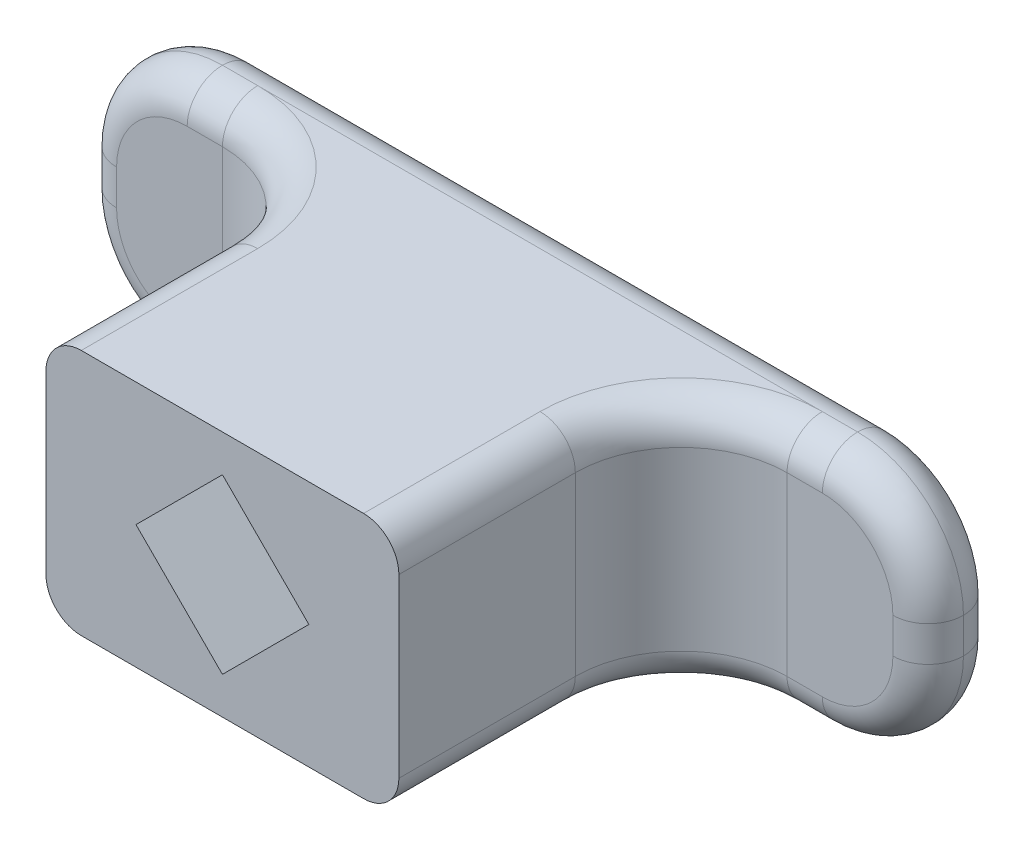
ISO-10303-21;
HEADER;
FILE_DESCRIPTION(('STEP AP214'),'2;1');
FILE_NAME('part.step','',(''),(''),'','','');
FILE_SCHEMA(('AUTOMOTIVE_DESIGN { 1 0 10303 214 1 1 1 1 }'));
ENDSEC;
DATA;
#1=APPLICATION_CONTEXT('core data for automotive mechanical design processes');
#2=APPLICATION_PROTOCOL_DEFINITION('international standard','automotive_design',2000,#1);
#3=PRODUCT_CONTEXT('',#1,'mechanical');
#4=PRODUCT('Part','Part','',(#3));
#5=PRODUCT_RELATED_PRODUCT_CATEGORY('part','',(#4));
#6=PRODUCT_DEFINITION_FORMATION('','',#4);
#7=PRODUCT_DEFINITION_CONTEXT('part definition',#1,'design');
#8=PRODUCT_DEFINITION('design','',#6,#7);
#9=PRODUCT_DEFINITION_SHAPE('','',#8);
#10=(LENGTH_UNIT() NAMED_UNIT(*) SI_UNIT(.MILLI.,.METRE.));
#11=(NAMED_UNIT(*) PLANE_ANGLE_UNIT() SI_UNIT($,.RADIAN.));
#12=(NAMED_UNIT(*) SI_UNIT($,.STERADIAN.) SOLID_ANGLE_UNIT());
#13=UNCERTAINTY_MEASURE_WITH_UNIT(LENGTH_MEASURE(1.E-05),#10,'distance_accuracy_value','');
#14=(GEOMETRIC_REPRESENTATION_CONTEXT(3) GLOBAL_UNCERTAINTY_ASSIGNED_CONTEXT((#13)) GLOBAL_UNIT_ASSIGNED_CONTEXT((#10,
#11,#12)) REPRESENTATION_CONTEXT('',''));
#15=CARTESIAN_POINT('',(0.,0.,0.));
#16=DIRECTION('',(0.,0.,1.));
#17=DIRECTION('',(1.,0.,0.));
#18=AXIS2_PLACEMENT_3D('',#15,#16,#17);
#19=CARTESIAN_POINT('',(5.,3.5,-8.));
#20=DIRECTION('',(-1.,0.,0.));
#21=DIRECTION('',(0.,0.,1.));
#22=AXIS2_PLACEMENT_3D('',#19,#20,#21);
#23=PLANE('',#22);
#24=DIRECTION('',(0.,-1.,0.));
#25=VECTOR('',#24,1.);
#26=CARTESIAN_POINT('',(5.00000000000002,3.5,-4.99999999999998));
#27=LINE('',#26,#25);
#28=CARTESIAN_POINT('',(5.00000000000002,-2.5,-4.99999999999998));
#29=VERTEX_POINT('',#28);
#30=CARTESIAN_POINT('',(5.00000000000002,2.5,-4.99999999999998));
#31=VERTEX_POINT('',#30);
#32=EDGE_CURVE('E340',#29,#31,#27,.F.);
#33=ORIENTED_EDGE('',*,*,#32,.T.);
#34=DIRECTION('',(0.,0.,-1.));
#35=VECTOR('',#34,1.);
#36=CARTESIAN_POINT('',(5.,2.5,-8.));
#37=LINE('',#36,#35);
#38=CARTESIAN_POINT('',(5.00000000000005,2.5,0.));
#39=VERTEX_POINT('',#38);
#40=EDGE_CURVE('E361',#31,#39,#37,.F.);
#41=ORIENTED_EDGE('',*,*,#40,.T.);
#42=DIRECTION('',(0.,-1.,0.));
#43=VECTOR('',#42,1.);
#44=CARTESIAN_POINT('',(5.00000000000005,3.5,0.));
#45=LINE('',#44,#43);
#46=CARTESIAN_POINT('',(5.00000000000005,-2.5,0.));
#47=VERTEX_POINT('',#46);
#48=EDGE_CURVE('E328',#39,#47,#45,.T.);
#49=ORIENTED_EDGE('',*,*,#48,.T.);
#50=DIRECTION('',(0.,0.,-1.));
#51=VECTOR('',#50,1.);
#52=CARTESIAN_POINT('',(5.00000000000002,-2.5,-4.99999999999998));
#53=LINE('',#52,#51);
#54=EDGE_CURVE('E359',#47,#29,#53,.T.);
#55=ORIENTED_EDGE('',*,*,#54,.T.);
#56=EDGE_LOOP('',(#33,#41,#49,#55));
#57=FACE_BOUND('',#56,.T.);
#58=ADVANCED_FACE('F35',(#57),#23,.F.);
#59=CARTESIAN_POINT('',(5.,3.5,-8.));
#60=DIRECTION('',(0.,0.,-1.));
#61=DIRECTION('',(-1.,0.,0.));
#62=AXIS2_PLACEMENT_3D('',#59,#60,#61);
#63=PLANE('',#62);
#64=DIRECTION('',(0.,-1.,0.));
#65=VECTOR('',#64,1.);
#66=CARTESIAN_POINT('',(8.00000000000002,-3.5,-8.));
#67=LINE('',#66,#65);
#68=CARTESIAN_POINT('',(8.00000000000002,2.5,-8.));
#69=VERTEX_POINT('',#68);
#70=CARTESIAN_POINT('',(8.00000000000002,-2.5,-8.));
#71=VERTEX_POINT('',#70);
#72=EDGE_CURVE('E337',#69,#71,#67,.T.);
#73=ORIENTED_EDGE('',*,*,#72,.T.);
#74=DIRECTION('',(1.,0.,0.));
#75=VECTOR('',#74,1.);
#76=CARTESIAN_POINT('',(9.,-2.5,-8.));
#77=LINE('',#76,#75);
#78=CARTESIAN_POINT('',(9.,-2.5,-8.));
#79=VERTEX_POINT('',#78);
#80=EDGE_CURVE('E393',#71,#79,#77,.T.);
#81=ORIENTED_EDGE('',*,*,#80,.T.);
#82=CARTESIAN_POINT('',(9.,-0.5,-8.));
#83=DIRECTION('',(0.,0.,-1.));
#84=DIRECTION('',(-1.,0.,0.));
#85=AXIS2_PLACEMENT_3D('',#82,#83,#84);
#86=CIRCLE('',#85,2.);
#87=CARTESIAN_POINT('',(11.,-0.5,-8.));
#88=VERTEX_POINT('',#87);
#89=EDGE_CURVE('E391',#79,#88,#86,.F.);
#90=ORIENTED_EDGE('',*,*,#89,.T.);
#91=DIRECTION('',(0.,-1.,0.));
#92=VECTOR('',#91,1.);
#93=CARTESIAN_POINT('',(11.,3.5,-8.));
#94=LINE('',#93,#92);
#95=CARTESIAN_POINT('',(11.,0.5,-8.));
#96=VERTEX_POINT('',#95);
#97=EDGE_CURVE('E389',#88,#96,#94,.F.);
#98=ORIENTED_EDGE('',*,*,#97,.T.);
#99=CARTESIAN_POINT('',(9.,0.5,-8.));
#100=DIRECTION('',(0.,0.,-1.));
#101=DIRECTION('',(-1.,0.,0.));
#102=AXIS2_PLACEMENT_3D('',#99,#100,#101);
#103=CIRCLE('',#102,2.);
#104=CARTESIAN_POINT('',(9.,2.5,-8.));
#105=VERTEX_POINT('',#104);
#106=EDGE_CURVE('E387',#96,#105,#103,.F.);
#107=ORIENTED_EDGE('',*,*,#106,.T.);
#108=DIRECTION('',(1.,0.,0.));
#109=VECTOR('',#108,1.);
#110=CARTESIAN_POINT('',(5.,2.5,-8.));
#111=LINE('',#110,#109);
#112=EDGE_CURVE('E385',#105,#69,#111,.F.);
#113=ORIENTED_EDGE('',*,*,#112,.T.);
#114=EDGE_LOOP('',(#73,#81,#90,#98,#107,#113));
#115=FACE_BOUND('',#114,.T.);
#116=ADVANCED_FACE('F514',(#115),#63,.F.);
#117=CARTESIAN_POINT('',(-12.,3.5,-10.));
#118=DIRECTION('',(0.,0.,1.));
#119=DIRECTION('',(1.,0.,0.));
#120=AXIS2_PLACEMENT_3D('',#117,#118,#119);
#121=PLANE('',#120);
#122=DIRECTION('',(0.,-1.,0.));
#123=VECTOR('',#122,1.);
#124=CARTESIAN_POINT('',(11.,3.5,-10.));
#125=LINE('',#124,#123);
#126=CARTESIAN_POINT('',(11.,0.5,-10.));
#127=VERTEX_POINT('',#126);
#128=CARTESIAN_POINT('',(11.,-0.5,-10.));
#129=VERTEX_POINT('',#128);
#130=EDGE_CURVE('E44',#127,#129,#125,.T.);
#131=ORIENTED_EDGE('',*,*,#130,.T.);
#132=CARTESIAN_POINT('',(9.,-0.5,-10.));
#133=DIRECTION('',(0.,0.,1.));
#134=DIRECTION('',(1.,0.,0.));
#135=AXIS2_PLACEMENT_3D('',#132,#133,#134);
#136=CIRCLE('',#135,2.);
#137=CARTESIAN_POINT('',(9.,-2.5,-10.));
#138=VERTEX_POINT('',#137);
#139=EDGE_CURVE('E11',#129,#138,#136,.F.);
#140=ORIENTED_EDGE('',*,*,#139,.T.);
#141=DIRECTION('',(-1.,0.,0.));
#142=VECTOR('',#141,1.);
#143=CARTESIAN_POINT('',(-9.,-2.5,-10.));
#144=LINE('',#143,#142);
#145=CARTESIAN_POINT('',(-9.,-2.5,-10.));
#146=VERTEX_POINT('',#145);
#147=EDGE_CURVE('E413',#138,#146,#144,.T.);
#148=ORIENTED_EDGE('',*,*,#147,.T.);
#149=CARTESIAN_POINT('',(-9.,-0.5,-10.));
#150=DIRECTION('',(0.,0.,1.));
#151=DIRECTION('',(1.,0.,0.));
#152=AXIS2_PLACEMENT_3D('',#149,#150,#151);
#153=CIRCLE('',#152,2.);
#154=CARTESIAN_POINT('',(-11.,-0.5,-10.));
#155=VERTEX_POINT('',#154);
#156=EDGE_CURVE('E415',#146,#155,#153,.F.);
#157=ORIENTED_EDGE('',*,*,#156,.T.);
#158=DIRECTION('',(0.,-1.,0.));
#159=VECTOR('',#158,1.);
#160=CARTESIAN_POINT('',(-11.,3.5,-10.));
#161=LINE('',#160,#159);
#162=CARTESIAN_POINT('',(-11.,0.5,-10.));
#163=VERTEX_POINT('',#162);
#164=EDGE_CURVE('E417',#155,#163,#161,.F.);
#165=ORIENTED_EDGE('',*,*,#164,.T.);
#166=CARTESIAN_POINT('',(-9.,0.5,-10.));
#167=DIRECTION('',(0.,0.,1.));
#168=DIRECTION('',(1.,0.,0.));
#169=AXIS2_PLACEMENT_3D('',#166,#167,#168);
#170=CIRCLE('',#169,2.);
#171=CARTESIAN_POINT('',(-9.,2.5,-10.));
#172=VERTEX_POINT('',#171);
#173=EDGE_CURVE('E220',#163,#172,#170,.F.);
#174=ORIENTED_EDGE('',*,*,#173,.T.);
#175=DIRECTION('',(-1.,0.,0.));
#176=VECTOR('',#175,1.);
#177=CARTESIAN_POINT('',(-12.,2.5,-10.));
#178=LINE('',#177,#176);
#179=CARTESIAN_POINT('',(9.,2.5,-10.));
#180=VERTEX_POINT('',#179);
#181=EDGE_CURVE('E215',#172,#180,#178,.F.);
#182=ORIENTED_EDGE('',*,*,#181,.T.);
#183=CARTESIAN_POINT('',(9.,0.5,-10.));
#184=DIRECTION('',(0.,0.,1.));
#185=DIRECTION('',(1.,0.,0.));
#186=AXIS2_PLACEMENT_3D('',#183,#184,#185);
#187=CIRCLE('',#186,2.);
#188=EDGE_CURVE('E218',#180,#127,#187,.F.);
#189=ORIENTED_EDGE('',*,*,#188,.T.);
#190=EDGE_LOOP('',(#131,#140,#148,#157,#165,#174,#182,#189));
#191=FACE_BOUND('',#190,.T.);
#192=ADVANCED_FACE('F217',(#191),#121,.F.);
#193=CARTESIAN_POINT('',(-5.,3.5,-8.));
#194=DIRECTION('',(0.,0.,-1.));
#195=DIRECTION('',(-1.,0.,0.));
#196=AXIS2_PLACEMENT_3D('',#193,#194,#195);
#197=PLANE('',#196);
#198=CARTESIAN_POINT('',(-9.,-0.5,-8.));
#199=DIRECTION('',(0.,0.,-1.));
#200=DIRECTION('',(-1.,0.,0.));
#201=AXIS2_PLACEMENT_3D('',#198,#199,#200);
#202=CIRCLE('',#201,2.);
#203=CARTESIAN_POINT('',(-11.,-0.5,-8.));
#204=VERTEX_POINT('',#203);
#205=CARTESIAN_POINT('',(-9.,-2.5,-8.));
#206=VERTEX_POINT('',#205);
#207=EDGE_CURVE('E409',#204,#206,#202,.F.);
#208=ORIENTED_EDGE('',*,*,#207,.T.);
#209=DIRECTION('',(1.,0.,0.));
#210=VECTOR('',#209,1.);
#211=CARTESIAN_POINT('',(-8.00000000000002,-2.5,-8.));
#212=LINE('',#211,#210);
#213=CARTESIAN_POINT('',(-8.00000000000002,-2.5,-8.));
#214=VERTEX_POINT('',#213);
#215=EDGE_CURVE('E411',#206,#214,#212,.T.);
#216=ORIENTED_EDGE('',*,*,#215,.T.);
#217=DIRECTION('',(0.,-1.,0.));
#218=VECTOR('',#217,1.);
#219=CARTESIAN_POINT('',(-8.00000000000002,3.5,-8.));
#220=LINE('',#219,#218);
#221=CARTESIAN_POINT('',(-8.00000000000002,2.5,-8.));
#222=VERTEX_POINT('',#221);
#223=EDGE_CURVE('E346',#214,#222,#220,.F.);
#224=ORIENTED_EDGE('',*,*,#223,.T.);
#225=DIRECTION('',(1.,0.,0.));
#226=VECTOR('',#225,1.);
#227=CARTESIAN_POINT('',(-5.,2.5,-8.));
#228=LINE('',#227,#226);
#229=CARTESIAN_POINT('',(-9.,2.5,-8.));
#230=VERTEX_POINT('',#229);
#231=EDGE_CURVE('E403',#222,#230,#228,.F.);
#232=ORIENTED_EDGE('',*,*,#231,.T.);
#233=CARTESIAN_POINT('',(-9.,0.5,-8.));
#234=DIRECTION('',(0.,0.,-1.));
#235=DIRECTION('',(-1.,0.,0.));
#236=AXIS2_PLACEMENT_3D('',#233,#234,#235);
#237=CIRCLE('',#236,2.);
#238=CARTESIAN_POINT('',(-11.,0.5,-8.));
#239=VERTEX_POINT('',#238);
#240=EDGE_CURVE('E405',#230,#239,#237,.F.);
#241=ORIENTED_EDGE('',*,*,#240,.T.);
#242=DIRECTION('',(0.,-1.,0.));
#243=VECTOR('',#242,1.);
#244=CARTESIAN_POINT('',(-11.,3.5,-8.));
#245=LINE('',#244,#243);
#246=EDGE_CURVE('E407',#239,#204,#245,.T.);
#247=ORIENTED_EDGE('',*,*,#246,.T.);
#248=EDGE_LOOP('',(#208,#216,#224,#232,#241,#247));
#249=FACE_BOUND('',#248,.T.);
#250=ADVANCED_FACE('F568',(#249),#197,.F.);
#251=CARTESIAN_POINT('',(-5.,3.5,-8.));
#252=DIRECTION('',(1.,0.,0.));
#253=DIRECTION('',(0.,0.,-1.));
#254=AXIS2_PLACEMENT_3D('',#251,#252,#253);
#255=PLANE('',#254);
#256=DIRECTION('',(0.,-1.,0.));
#257=VECTOR('',#256,1.);
#258=CARTESIAN_POINT('',(-5.00000000000002,-3.5,-4.99999999999998));
#259=LINE('',#258,#257);
#260=CARTESIAN_POINT('',(-5.00000000000002,2.5,-4.99999999999998));
#261=VERTEX_POINT('',#260);
#262=CARTESIAN_POINT('',(-5.00000000000002,-2.5,-4.99999999999998));
#263=VERTEX_POINT('',#262);
#264=EDGE_CURVE('E343',#261,#263,#259,.T.);
#265=ORIENTED_EDGE('',*,*,#264,.T.);
#266=DIRECTION('',(0.,0.,1.));
#267=VECTOR('',#266,1.);
#268=CARTESIAN_POINT('',(-5.00000000000005,-2.5,0.));
#269=LINE('',#268,#267);
#270=CARTESIAN_POINT('',(-5.00000000000005,-2.5,0.));
#271=VERTEX_POINT('',#270);
#272=EDGE_CURVE('E397',#263,#271,#269,.T.);
#273=ORIENTED_EDGE('',*,*,#272,.T.);
#274=DIRECTION('',(0.,-1.,0.));
#275=VECTOR('',#274,1.);
#276=CARTESIAN_POINT('',(-5.00000000000005,3.5,0.));
#277=LINE('',#276,#275);
#278=CARTESIAN_POINT('',(-5.00000000000005,2.5,0.));
#279=VERTEX_POINT('',#278);
#280=EDGE_CURVE('E334',#279,#271,#277,.T.);
#281=ORIENTED_EDGE('',*,*,#280,.F.);
#282=DIRECTION('',(0.,0.,1.));
#283=VECTOR('',#282,1.);
#284=CARTESIAN_POINT('',(-5.,2.5,-8.));
#285=LINE('',#284,#283);
#286=EDGE_CURVE('E395',#279,#261,#285,.F.);
#287=ORIENTED_EDGE('',*,*,#286,.T.);
#288=EDGE_LOOP('',(#265,#273,#281,#287));
#289=FACE_BOUND('',#288,.T.);
#290=ADVANCED_FACE('F492',(#289),#255,.F.);
#291=CARTESIAN_POINT('',(5.00000000000005,3.5,0.));
#292=DIRECTION('',(0.,0.,-1.));
#293=DIRECTION('',(-1.,0.,0.));
#294=AXIS2_PLACEMENT_3D('',#291,#292,#293);
#295=PLANE('',#294);
#296=DIRECTION('',(-0.707106781186548,0.707106781186548,0.));
#297=VECTOR('',#296,1.);
#298=CARTESIAN_POINT('',(2.45,0.,0.));
#299=LINE('',#298,#297);
#300=CARTESIAN_POINT('',(2.45,0.,0.));
#301=VERTEX_POINT('',#300);
#302=CARTESIAN_POINT('',(0.,2.45,0.));
#303=VERTEX_POINT('',#302);
#304=EDGE_CURVE('E625',#301,#303,#299,.T.);
#305=ORIENTED_EDGE('',*,*,#304,.F.);
#306=DIRECTION('',(0.707106781186547,0.707106781186548,0.));
#307=VECTOR('',#306,1.);
#308=CARTESIAN_POINT('',(2.45,0.,0.));
#309=LINE('',#308,#307);
#310=CARTESIAN_POINT('',(0.,-2.45,0.));
#311=VERTEX_POINT('',#310);
#312=EDGE_CURVE('E52',#311,#301,#309,.T.);
#313=ORIENTED_EDGE('',*,*,#312,.F.);
#314=DIRECTION('',(0.707106781186548,-0.707106781186548,0.));
#315=VECTOR('',#314,1.);
#316=CARTESIAN_POINT('',(0.,-2.45,0.));
#317=LINE('',#316,#315);
#318=CARTESIAN_POINT('',(-2.45,0.,0.));
#319=VERTEX_POINT('',#318);
#320=EDGE_CURVE('E613',#319,#311,#317,.T.);
#321=ORIENTED_EDGE('',*,*,#320,.F.);
#322=DIRECTION('',(-0.707106781186548,-0.707106781186548,0.));
#323=VECTOR('',#322,1.);
#324=CARTESIAN_POINT('',(0.,2.45,0.));
#325=LINE('',#324,#323);
#326=EDGE_CURVE('E618',#303,#319,#325,.T.);
#327=ORIENTED_EDGE('',*,*,#326,.F.);
#328=EDGE_LOOP('',(#305,#313,#321,#327));
#329=FACE_BOUND('',#328,.T.);
#330=ORIENTED_EDGE('',*,*,#48,.F.);
#331=CARTESIAN_POINT('',(4.00000000000005,2.5,0.));
#332=DIRECTION('',(0.,0.,-1.));
#333=DIRECTION('',(-1.,0.,0.));
#334=AXIS2_PLACEMENT_3D('',#331,#332,#333);
#335=CIRCLE('',#334,1.);
#336=CARTESIAN_POINT('',(4.00000000000005,3.5,0.));
#337=VERTEX_POINT('',#336);
#338=EDGE_CURVE('E369',#39,#337,#335,.F.);
#339=ORIENTED_EDGE('',*,*,#338,.T.);
#340=DIRECTION('',(1.,0.,0.));
#341=VECTOR('',#340,1.);
#342=CARTESIAN_POINT('',(5.00000000000005,3.5,0.));
#343=LINE('',#342,#341);
#344=CARTESIAN_POINT('',(-4.00000000000005,3.5,0.));
#345=VERTEX_POINT('',#344);
#346=EDGE_CURVE('E323',#345,#337,#343,.T.);
#347=ORIENTED_EDGE('',*,*,#346,.F.);
#348=CARTESIAN_POINT('',(-4.00000000000005,2.5,0.));
#349=DIRECTION('',(0.,0.,-1.));
#350=DIRECTION('',(-1.,0.,0.));
#351=AXIS2_PLACEMENT_3D('',#348,#349,#350);
#352=CIRCLE('',#351,1.);
#353=EDGE_CURVE('E363',#345,#279,#352,.F.);
#354=ORIENTED_EDGE('',*,*,#353,.T.);
#355=ORIENTED_EDGE('',*,*,#280,.T.);
#356=CARTESIAN_POINT('',(-4.00000000000005,-2.5,0.));
#357=DIRECTION('',(0.,0.,-1.));
#358=DIRECTION('',(-1.,0.,0.));
#359=AXIS2_PLACEMENT_3D('',#356,#357,#358);
#360=CIRCLE('',#359,1.);
#361=CARTESIAN_POINT('',(-4.00000000000005,-3.5,0.));
#362=VERTEX_POINT('',#361);
#363=EDGE_CURVE('E365',#271,#362,#360,.F.);
#364=ORIENTED_EDGE('',*,*,#363,.T.);
#365=DIRECTION('',(1.,0.,0.));
#366=VECTOR('',#365,1.);
#367=CARTESIAN_POINT('',(5.00000000000005,-3.5,0.));
#368=LINE('',#367,#366);
#369=CARTESIAN_POINT('',(4.00000000000005,-3.5,0.));
#370=VERTEX_POINT('',#369);
#371=EDGE_CURVE('E317',#362,#370,#368,.T.);
#372=ORIENTED_EDGE('',*,*,#371,.T.);
#373=CARTESIAN_POINT('',(4.00000000000005,-2.5,0.));
#374=DIRECTION('',(0.,0.,-1.));
#375=DIRECTION('',(-1.,0.,0.));
#376=AXIS2_PLACEMENT_3D('',#373,#374,#375);
#377=CIRCLE('',#376,1.);
#378=EDGE_CURVE('E367',#370,#47,#377,.F.);
#379=ORIENTED_EDGE('',*,*,#378,.T.);
#380=EDGE_LOOP('',(#330,#339,#347,#354,#355,#364,#372,#379));
#381=FACE_BOUND('',#380,.T.);
#382=ADVANCED_FACE('F489',(#329,#381),#295,.F.);
#383=CARTESIAN_POINT('',(0.,3.5,0.));
#384=DIRECTION('',(0.,-1.,0.));
#385=DIRECTION('',(0.,0.,-1.));
#386=AXIS2_PLACEMENT_3D('',#383,#384,#385);
#387=PLANE('',#386);
#388=ORIENTED_EDGE('',*,*,#346,.T.);
#389=DIRECTION('',(0.,0.,-1.));
#390=VECTOR('',#389,1.);
#391=CARTESIAN_POINT('',(4.00000000000005,3.5,0.));
#392=LINE('',#391,#390);
#393=CARTESIAN_POINT('',(4.00000000000002,3.5,-4.99999999999998));
#394=VERTEX_POINT('',#393);
#395=EDGE_CURVE('E356',#337,#394,#392,.T.);
#396=ORIENTED_EDGE('',*,*,#395,.T.);
#397=CARTESIAN_POINT('',(8.00000000000002,3.5,-5.));
#398=DIRECTION('',(0.,-1.,0.));
#399=DIRECTION('',(0.,0.,-1.));
#400=AXIS2_PLACEMENT_3D('',#397,#398,#399);
#401=CIRCLE('',#400,4.);
#402=CARTESIAN_POINT('',(8.00000000000002,3.5,-9.));
#403=VERTEX_POINT('',#402);
#404=EDGE_CURVE('E354',#394,#403,#401,.T.);
#405=ORIENTED_EDGE('',*,*,#404,.T.);
#406=DIRECTION('',(-1.,0.,0.));
#407=VECTOR('',#406,1.);
#408=CARTESIAN_POINT('',(0.,3.5,-9.));
#409=LINE('',#408,#407);
#410=CARTESIAN_POINT('',(-8.00000000000002,3.5,-9.));
#411=VERTEX_POINT('',#410);
#412=EDGE_CURVE('E351',#403,#411,#409,.T.);
#413=ORIENTED_EDGE('',*,*,#412,.T.);
#414=CARTESIAN_POINT('',(-8.00000000000002,3.5,-5.));
#415=DIRECTION('',(0.,-1.,0.));
#416=DIRECTION('',(0.,0.,-1.));
#417=AXIS2_PLACEMENT_3D('',#414,#415,#416);
#418=CIRCLE('',#417,4.);
#419=CARTESIAN_POINT('',(-4.00000000000002,3.5,-4.99999999999998));
#420=VERTEX_POINT('',#419);
#421=EDGE_CURVE('E349',#411,#420,#418,.T.);
#422=ORIENTED_EDGE('',*,*,#421,.T.);
#423=DIRECTION('',(0.,0.,1.));
#424=VECTOR('',#423,1.);
#425=CARTESIAN_POINT('',(-4.00000000000005,3.5,0.));
#426=LINE('',#425,#424);
#427=EDGE_CURVE('E102',#420,#345,#426,.T.);
#428=ORIENTED_EDGE('',*,*,#427,.T.);
#429=EDGE_LOOP('',(#388,#396,#405,#413,#422,#428));
#430=FACE_BOUND('',#429,.T.);
#431=ADVANCED_FACE('F482',(#430),#387,.F.);
#432=CARTESIAN_POINT('',(0.,-3.5,0.));
#433=DIRECTION('',(0.,-1.,0.));
#434=DIRECTION('',(0.,0.,-1.));
#435=AXIS2_PLACEMENT_3D('',#432,#433,#434);
#436=PLANE('',#435);
#437=CARTESIAN_POINT('',(8.00000000000002,-3.5,-5.));
#438=DIRECTION('',(0.,-1.,0.));
#439=DIRECTION('',(0.,0.,-1.));
#440=AXIS2_PLACEMENT_3D('',#437,#438,#439);
#441=CIRCLE('',#440,4.);
#442=CARTESIAN_POINT('',(8.00000000000002,-3.5,-9.));
#443=VERTEX_POINT('',#442);
#444=CARTESIAN_POINT('',(4.00000000000002,-3.5,-4.99999999999998));
#445=VERTEX_POINT('',#444);
#446=EDGE_CURVE('E377',#443,#445,#441,.F.);
#447=ORIENTED_EDGE('',*,*,#446,.T.);
#448=DIRECTION('',(0.,0.,-1.));
#449=VECTOR('',#448,1.);
#450=CARTESIAN_POINT('',(4.00000000000005,-3.5,0.));
#451=LINE('',#450,#449);
#452=EDGE_CURVE('E379',#445,#370,#451,.F.);
#453=ORIENTED_EDGE('',*,*,#452,.T.);
#454=ORIENTED_EDGE('',*,*,#371,.F.);
#455=DIRECTION('',(0.,0.,1.));
#456=VECTOR('',#455,1.);
#457=CARTESIAN_POINT('',(-4.00000000000002,-3.5,-4.99999999999998));
#458=LINE('',#457,#456);
#459=CARTESIAN_POINT('',(-4.00000000000002,-3.5,-4.99999999999998));
#460=VERTEX_POINT('',#459);
#461=EDGE_CURVE('E375',#362,#460,#458,.F.);
#462=ORIENTED_EDGE('',*,*,#461,.T.);
#463=CARTESIAN_POINT('',(-8.00000000000002,-3.5,-5.));
#464=DIRECTION('',(0.,-1.,0.));
#465=DIRECTION('',(0.,0.,-1.));
#466=AXIS2_PLACEMENT_3D('',#463,#464,#465);
#467=CIRCLE('',#466,4.);
#468=CARTESIAN_POINT('',(-8.00000000000002,-3.5,-9.));
#469=VERTEX_POINT('',#468);
#470=EDGE_CURVE('E373',#460,#469,#467,.F.);
#471=ORIENTED_EDGE('',*,*,#470,.T.);
#472=DIRECTION('',(-1.,0.,0.));
#473=VECTOR('',#472,1.);
#474=CARTESIAN_POINT('',(9.,-3.5,-9.));
#475=LINE('',#474,#473);
#476=EDGE_CURVE('E371',#469,#443,#475,.F.);
#477=ORIENTED_EDGE('',*,*,#476,.T.);
#478=EDGE_LOOP('',(#447,#453,#454,#462,#471,#477));
#479=FACE_BOUND('',#478,.T.);
#480=ADVANCED_FACE('F498',(#479),#436,.T.);
#481=CARTESIAN_POINT('',(8.00000000000002,3.5,-5.));
#482=DIRECTION('',(0.,1.,0.));
#483=DIRECTION('',(0.,0.,1.));
#484=AXIS2_PLACEMENT_3D('',#481,#482,#483);
#485=CYLINDRICAL_SURFACE('',#484,3.);
#486=ORIENTED_EDGE('',*,*,#32,.F.);
#487=CARTESIAN_POINT('',(8.00000000000002,-2.5,-5.));
#488=DIRECTION('',(0.,-1.,0.));
#489=DIRECTION('',(0.,0.,-1.));
#490=AXIS2_PLACEMENT_3D('',#487,#488,#489);
#491=CIRCLE('',#490,3.);
#492=EDGE_CURVE('E383',#29,#71,#491,.T.);
#493=ORIENTED_EDGE('',*,*,#492,.T.);
#494=ORIENTED_EDGE('',*,*,#72,.F.);
#495=CARTESIAN_POINT('',(8.00000000000002,2.5,-5.));
#496=DIRECTION('',(0.,-1.,0.));
#497=DIRECTION('',(0.,0.,-1.));
#498=AXIS2_PLACEMENT_3D('',#495,#496,#497);
#499=CIRCLE('',#498,3.);
#500=EDGE_CURVE('E381',#69,#31,#499,.F.);
#501=ORIENTED_EDGE('',*,*,#500,.T.);
#502=EDGE_LOOP('',(#486,#493,#494,#501));
#503=FACE_BOUND('',#502,.T.);
#504=ADVANCED_FACE('F511',(#503),#485,.F.);
#505=CARTESIAN_POINT('',(-8.00000000000002,3.5,-5.));
#506=DIRECTION('',(0.,1.,0.));
#507=DIRECTION('',(0.,0.,1.));
#508=AXIS2_PLACEMENT_3D('',#505,#506,#507);
#509=CYLINDRICAL_SURFACE('',#508,3.);
#510=ORIENTED_EDGE('',*,*,#223,.F.);
#511=CARTESIAN_POINT('',(-8.00000000000002,-2.5,-5.));
#512=DIRECTION('',(0.,-1.,0.));
#513=DIRECTION('',(0.,0.,-1.));
#514=AXIS2_PLACEMENT_3D('',#511,#512,#513);
#515=CIRCLE('',#514,3.);
#516=EDGE_CURVE('E401',#214,#263,#515,.T.);
#517=ORIENTED_EDGE('',*,*,#516,.T.);
#518=ORIENTED_EDGE('',*,*,#264,.F.);
#519=CARTESIAN_POINT('',(-8.00000000000002,2.5,-5.));
#520=DIRECTION('',(0.,-1.,0.));
#521=DIRECTION('',(0.,0.,-1.));
#522=AXIS2_PLACEMENT_3D('',#519,#520,#521);
#523=CIRCLE('',#522,3.);
#524=EDGE_CURVE('E399',#261,#222,#523,.F.);
#525=ORIENTED_EDGE('',*,*,#524,.T.);
#526=EDGE_LOOP('',(#510,#517,#518,#525));
#527=FACE_BOUND('',#526,.T.);
#528=ADVANCED_FACE('F549',(#527),#509,.F.);
#529=CARTESIAN_POINT('',(-4.,-2.5,-7.99999999999999));
#530=DIRECTION('',(0.,0.,-1.));
#531=DIRECTION('',(-1.,0.,0.));
#532=AXIS2_PLACEMENT_3D('',#529,#530,#531);
#533=CYLINDRICAL_SURFACE('',#532,1.);
#534=ORIENTED_EDGE('',*,*,#363,.F.);
#535=ORIENTED_EDGE('',*,*,#272,.F.);
#536=CARTESIAN_POINT('',(-4.00000000000002,-2.5,-4.99999999999998));
#537=DIRECTION('',(0.,0.,-1.));
#538=DIRECTION('',(-1.,0.,0.));
#539=AXIS2_PLACEMENT_3D('',#536,#537,#538);
#540=CIRCLE('',#539,1.);
#541=EDGE_CURVE('E39',#460,#263,#540,.T.);
#542=ORIENTED_EDGE('',*,*,#541,.F.);
#543=ORIENTED_EDGE('',*,*,#461,.F.);
#544=EDGE_LOOP('',(#534,#535,#542,#543));
#545=FACE_BOUND('',#544,.T.);
#546=ADVANCED_FACE('F37',(#545),#533,.T.);
#547=CARTESIAN_POINT('',(-8.00000000000002,-2.5,-5.));
#548=DIRECTION('',(0.,-1.,0.));
#549=DIRECTION('',(0.,0.,-1.));
#550=AXIS2_PLACEMENT_3D('',#547,#548,#549);
#551=TOROIDAL_SURFACE('',#550,4.,1.);
#552=ORIENTED_EDGE('',*,*,#541,.T.);
#553=ORIENTED_EDGE('',*,*,#516,.F.);
#554=CARTESIAN_POINT('',(-8.00000000000002,-2.5,-9.));
#555=DIRECTION('',(-1.,0.,0.));
#556=DIRECTION('',(0.,0.,1.));
#557=AXIS2_PLACEMENT_3D('',#554,#555,#556);
#558=CIRCLE('',#557,1.);
#559=EDGE_CURVE('E313',#469,#214,#558,.T.);
#560=ORIENTED_EDGE('',*,*,#559,.F.);
#561=ORIENTED_EDGE('',*,*,#470,.F.);
#562=EDGE_LOOP('',(#552,#553,#560,#561));
#563=FACE_BOUND('',#562,.T.);
#564=ADVANCED_FACE('F555',(#563),#551,.T.);
#565=CARTESIAN_POINT('',(-5.,-2.5,-9.));
#566=DIRECTION('',(-1.,0.,0.));
#567=DIRECTION('',(0.,0.,1.));
#568=AXIS2_PLACEMENT_3D('',#565,#566,#567);
#569=CYLINDRICAL_SURFACE('',#568,1.);
#570=ORIENTED_EDGE('',*,*,#559,.T.);
#571=ORIENTED_EDGE('',*,*,#215,.F.);
#572=CARTESIAN_POINT('',(-9.,-2.5,-9.));
#573=DIRECTION('',(-1.,0.,0.));
#574=DIRECTION('',(0.,0.,1.));
#575=AXIS2_PLACEMENT_3D('',#572,#573,#574);
#576=CIRCLE('',#575,1.);
#577=CARTESIAN_POINT('',(-9.,-3.5,-9.));
#578=VERTEX_POINT('',#577);
#579=EDGE_CURVE('E93',#578,#206,#576,.T.);
#580=ORIENTED_EDGE('',*,*,#579,.F.);
#581=DIRECTION('',(1.,0.,0.));
#582=VECTOR('',#581,1.);
#583=CARTESIAN_POINT('',(-9.,-3.5,-9.));
#584=LINE('',#583,#582);
#585=EDGE_CURVE('E311',#469,#578,#584,.F.);
#586=ORIENTED_EDGE('',*,*,#585,.F.);
#587=EDGE_LOOP('',(#570,#571,#580,#586));
#588=FACE_BOUND('',#587,.T.);
#589=ADVANCED_FACE('F558',(#588),#569,.T.);
#590=CARTESIAN_POINT('',(4.,-2.5,-7.99999999999999));
#591=DIRECTION('',(0.,0.,1.));
#592=DIRECTION('',(1.,0.,0.));
#593=AXIS2_PLACEMENT_3D('',#590,#591,#592);
#594=CYLINDRICAL_SURFACE('',#593,1.);
#595=ORIENTED_EDGE('',*,*,#378,.F.);
#596=ORIENTED_EDGE('',*,*,#452,.F.);
#597=CARTESIAN_POINT('',(4.00000000000002,-2.5,-4.99999999999998));
#598=DIRECTION('',(0.,0.,-1.));
#599=DIRECTION('',(-1.,0.,0.));
#600=AXIS2_PLACEMENT_3D('',#597,#598,#599);
#601=CIRCLE('',#600,1.);
#602=EDGE_CURVE('E308',#29,#445,#601,.T.);
#603=ORIENTED_EDGE('',*,*,#602,.F.);
#604=ORIENTED_EDGE('',*,*,#54,.F.);
#605=EDGE_LOOP('',(#595,#596,#603,#604));
#606=FACE_BOUND('',#605,.T.);
#607=ADVANCED_FACE('F503',(#606),#594,.T.);
#608=CARTESIAN_POINT('',(-9.,-0.5,-9.));
#609=DIRECTION('',(0.,0.,-1.));
#610=DIRECTION('',(-1.,0.,0.));
#611=AXIS2_PLACEMENT_3D('',#608,#609,#610);
#612=TOROIDAL_SURFACE('',#611,2.,1.);
#613=ORIENTED_EDGE('',*,*,#579,.T.);
#614=ORIENTED_EDGE('',*,*,#207,.F.);
#615=CARTESIAN_POINT('',(-11.,-0.5,-9.));
#616=DIRECTION('',(0.,1.,0.));
#617=DIRECTION('',(0.,0.,1.));
#618=AXIS2_PLACEMENT_3D('',#615,#616,#617);
#619=CIRCLE('',#618,1.);
#620=CARTESIAN_POINT('',(-12.,-0.5,-9.));
#621=VERTEX_POINT('',#620);
#622=EDGE_CURVE('E305',#621,#204,#619,.T.);
#623=ORIENTED_EDGE('',*,*,#622,.F.);
#624=CARTESIAN_POINT('',(-9.,-0.5,-9.));
#625=DIRECTION('',(0.,0.,-1.));
#626=DIRECTION('',(-1.,0.,0.));
#627=AXIS2_PLACEMENT_3D('',#624,#625,#626);
#628=CIRCLE('',#627,3.);
#629=EDGE_CURVE('E302',#578,#621,#628,.T.);
#630=ORIENTED_EDGE('',*,*,#629,.F.);
#631=EDGE_LOOP('',(#613,#614,#623,#630));
#632=FACE_BOUND('',#631,.T.);
#633=ADVANCED_FACE('F560',(#632),#612,.T.);
#634=CARTESIAN_POINT('',(-12.,-2.5,-9.));
#635=DIRECTION('',(1.,0.,0.));
#636=DIRECTION('',(0.,0.,-1.));
#637=AXIS2_PLACEMENT_3D('',#634,#635,#636);
#638=CYLINDRICAL_SURFACE('',#637,1.);
#639=ORIENTED_EDGE('',*,*,#476,.F.);
#640=ORIENTED_EDGE('',*,*,#585,.T.);
#641=CARTESIAN_POINT('',(-9.,-2.5,-9.));
#642=DIRECTION('',(-1.,0.,0.));
#643=DIRECTION('',(0.,0.,1.));
#644=AXIS2_PLACEMENT_3D('',#641,#642,#643);
#645=CIRCLE('',#644,1.);
#646=EDGE_CURVE('E299',#146,#578,#645,.T.);
#647=ORIENTED_EDGE('',*,*,#646,.F.);
#648=ORIENTED_EDGE('',*,*,#147,.F.);
#649=CARTESIAN_POINT('',(9.,-2.5,-9.));
#650=DIRECTION('',(1.,0.,0.));
#651=DIRECTION('',(0.,0.,-1.));
#652=AXIS2_PLACEMENT_3D('',#649,#650,#651);
#653=CIRCLE('',#652,1.);
#654=CARTESIAN_POINT('',(9.,-3.5,-9.));
#655=VERTEX_POINT('',#654);
#656=EDGE_CURVE('E297',#655,#138,#653,.T.);
#657=ORIENTED_EDGE('',*,*,#656,.F.);
#658=DIRECTION('',(-1.,0.,0.));
#659=VECTOR('',#658,1.);
#660=CARTESIAN_POINT('',(9.,-3.5,-9.));
#661=LINE('',#660,#659);
#662=EDGE_CURVE('E294',#443,#655,#661,.F.);
#663=ORIENTED_EDGE('',*,*,#662,.F.);
#664=EDGE_LOOP('',(#639,#640,#647,#648,#657,#663));
#665=FACE_BOUND('',#664,.T.);
#666=ADVANCED_FACE('F456',(#665),#638,.T.);
#667=CARTESIAN_POINT('',(8.00000000000002,-2.5,-5.));
#668=DIRECTION('',(0.,-1.,0.));
#669=DIRECTION('',(0.,0.,-1.));
#670=AXIS2_PLACEMENT_3D('',#667,#668,#669);
#671=TOROIDAL_SURFACE('',#670,4.,1.);
#672=ORIENTED_EDGE('',*,*,#602,.T.);
#673=ORIENTED_EDGE('',*,*,#446,.F.);
#674=CARTESIAN_POINT('',(8.00000000000002,-2.5,-9.));
#675=DIRECTION('',(1.,0.,0.));
#676=DIRECTION('',(0.,0.,-1.));
#677=AXIS2_PLACEMENT_3D('',#674,#675,#676);
#678=CIRCLE('',#677,1.);
#679=EDGE_CURVE('E291',#71,#443,#678,.T.);
#680=ORIENTED_EDGE('',*,*,#679,.F.);
#681=ORIENTED_EDGE('',*,*,#492,.F.);
#682=EDGE_LOOP('',(#672,#673,#680,#681));
#683=FACE_BOUND('',#682,.T.);
#684=ADVANCED_FACE('F507',(#683),#671,.T.);
#685=CARTESIAN_POINT('',(-4.00000000000005,2.5,0.));
#686=DIRECTION('',(0.,0.,1.));
#687=DIRECTION('',(1.,0.,0.));
#688=AXIS2_PLACEMENT_3D('',#685,#686,#687);
#689=CYLINDRICAL_SURFACE('',#688,1.);
#690=ORIENTED_EDGE('',*,*,#353,.F.);
#691=ORIENTED_EDGE('',*,*,#427,.F.);
#692=CARTESIAN_POINT('',(-4.00000000000002,2.5,-4.99999999999998));
#693=DIRECTION('',(0.,0.,-1.));
#694=DIRECTION('',(-1.,0.,0.));
#695=AXIS2_PLACEMENT_3D('',#692,#693,#694);
#696=CIRCLE('',#695,1.);
#697=EDGE_CURVE('E288',#261,#420,#696,.T.);
#698=ORIENTED_EDGE('',*,*,#697,.F.);
#699=ORIENTED_EDGE('',*,*,#286,.F.);
#700=EDGE_LOOP('',(#690,#691,#698,#699));
#701=FACE_BOUND('',#700,.T.);
#702=ADVANCED_FACE('F485',(#701),#689,.T.);
#703=CARTESIAN_POINT('',(-11.,3.5,-9.));
#704=DIRECTION('',(0.,-1.,0.));
#705=DIRECTION('',(0.,0.,-1.));
#706=AXIS2_PLACEMENT_3D('',#703,#704,#705);
#707=CYLINDRICAL_SURFACE('',#706,1.);
#708=ORIENTED_EDGE('',*,*,#622,.T.);
#709=ORIENTED_EDGE('',*,*,#246,.F.);
#710=CARTESIAN_POINT('',(-11.,0.5,-9.));
#711=DIRECTION('',(0.,1.,0.));
#712=DIRECTION('',(0.,0.,1.));
#713=AXIS2_PLACEMENT_3D('',#710,#711,#712);
#714=CIRCLE('',#713,1.);
#715=CARTESIAN_POINT('',(-12.,0.5,-9.));
#716=VERTEX_POINT('',#715);
#717=EDGE_CURVE('E285',#716,#239,#714,.T.);
#718=ORIENTED_EDGE('',*,*,#717,.F.);
#719=DIRECTION('',(0.,-1.,0.));
#720=VECTOR('',#719,1.);
#721=CARTESIAN_POINT('',(-12.,3.5,-9.));
#722=LINE('',#721,#720);
#723=EDGE_CURVE('E282',#621,#716,#722,.F.);
#724=ORIENTED_EDGE('',*,*,#723,.F.);
#725=EDGE_LOOP('',(#708,#709,#718,#724));
#726=FACE_BOUND('',#725,.T.);
#727=ADVANCED_FACE('F564',(#726),#707,.T.);
#728=CARTESIAN_POINT('',(-9.,-0.5,-9.));
#729=DIRECTION('',(0.,0.,1.));
#730=DIRECTION('',(1.,0.,0.));
#731=AXIS2_PLACEMENT_3D('',#728,#729,#730);
#732=TOROIDAL_SURFACE('',#731,2.,1.);
#733=ORIENTED_EDGE('',*,*,#646,.T.);
#734=ORIENTED_EDGE('',*,*,#629,.T.);
#735=CARTESIAN_POINT('',(-11.,-0.5,-9.));
#736=DIRECTION('',(0.,1.,0.));
#737=DIRECTION('',(0.,0.,1.));
#738=AXIS2_PLACEMENT_3D('',#735,#736,#737);
#739=CIRCLE('',#738,1.);
#740=EDGE_CURVE('E279',#155,#621,#739,.T.);
#741=ORIENTED_EDGE('',*,*,#740,.F.);
#742=ORIENTED_EDGE('',*,*,#156,.F.);
#743=EDGE_LOOP('',(#733,#734,#741,#742));
#744=FACE_BOUND('',#743,.T.);
#745=ADVANCED_FACE('F464',(#744),#732,.T.);
#746=CARTESIAN_POINT('',(9.,-0.5,-9.));
#747=DIRECTION('',(0.,0.,1.));
#748=DIRECTION('',(1.,0.,0.));
#749=AXIS2_PLACEMENT_3D('',#746,#747,#748);
#750=TOROIDAL_SURFACE('',#749,2.,1.);
#751=ORIENTED_EDGE('',*,*,#656,.T.);
#752=ORIENTED_EDGE('',*,*,#139,.F.);
#753=CARTESIAN_POINT('',(11.,-0.5,-9.));
#754=DIRECTION('',(0.,1.,0.));
#755=DIRECTION('',(0.,0.,1.));
#756=AXIS2_PLACEMENT_3D('',#753,#754,#755);
#757=CIRCLE('',#756,1.);
#758=CARTESIAN_POINT('',(12.,-0.5,-9.));
#759=VERTEX_POINT('',#758);
#760=EDGE_CURVE('E276',#759,#129,#757,.T.);
#761=ORIENTED_EDGE('',*,*,#760,.F.);
#762=CARTESIAN_POINT('',(9.,-0.5,-9.));
#763=DIRECTION('',(0.,0.,1.));
#764=DIRECTION('',(1.,0.,0.));
#765=AXIS2_PLACEMENT_3D('',#762,#763,#764);
#766=CIRCLE('',#765,3.);
#767=EDGE_CURVE('E273',#655,#759,#766,.T.);
#768=ORIENTED_EDGE('',*,*,#767,.F.);
#769=EDGE_LOOP('',(#751,#752,#761,#768));
#770=FACE_BOUND('',#769,.T.);
#771=ADVANCED_FACE('F444',(#770),#750,.T.);
#772=CARTESIAN_POINT('',(5.,-2.5,-9.));
#773=DIRECTION('',(-1.,0.,0.));
#774=DIRECTION('',(0.,0.,1.));
#775=AXIS2_PLACEMENT_3D('',#772,#773,#774);
#776=CYLINDRICAL_SURFACE('',#775,1.);
#777=ORIENTED_EDGE('',*,*,#679,.T.);
#778=ORIENTED_EDGE('',*,*,#662,.T.);
#779=CARTESIAN_POINT('',(9.,-2.5,-9.));
#780=DIRECTION('',(1.,0.,0.));
#781=DIRECTION('',(0.,0.,-1.));
#782=AXIS2_PLACEMENT_3D('',#779,#780,#781);
#783=CIRCLE('',#782,1.);
#784=EDGE_CURVE('E270',#79,#655,#783,.T.);
#785=ORIENTED_EDGE('',*,*,#784,.F.);
#786=ORIENTED_EDGE('',*,*,#80,.F.);
#787=EDGE_LOOP('',(#777,#778,#785,#786));
#788=FACE_BOUND('',#787,.T.);
#789=ADVANCED_FACE('F451',(#788),#776,.T.);
#790=CARTESIAN_POINT('',(-8.00000000000002,2.5,-5.));
#791=DIRECTION('',(0.,-1.,0.));
#792=DIRECTION('',(0.,0.,-1.));
#793=AXIS2_PLACEMENT_3D('',#790,#791,#792);
#794=TOROIDAL_SURFACE('',#793,4.,1.);
#795=ORIENTED_EDGE('',*,*,#697,.T.);
#796=ORIENTED_EDGE('',*,*,#421,.F.);
#797=CARTESIAN_POINT('',(-8.00000000000002,2.5,-9.));
#798=DIRECTION('',(-1.,0.,0.));
#799=DIRECTION('',(0.,0.,1.));
#800=AXIS2_PLACEMENT_3D('',#797,#798,#799);
#801=CIRCLE('',#800,1.);
#802=EDGE_CURVE('E267',#222,#411,#801,.T.);
#803=ORIENTED_EDGE('',*,*,#802,.F.);
#804=ORIENTED_EDGE('',*,*,#524,.F.);
#805=EDGE_LOOP('',(#795,#796,#803,#804));
#806=FACE_BOUND('',#805,.T.);
#807=ADVANCED_FACE('F480',(#806),#794,.T.);
#808=CARTESIAN_POINT('',(-9.,0.5,-9.));
#809=DIRECTION('',(0.,0.,-1.));
#810=DIRECTION('',(-1.,0.,0.));
#811=AXIS2_PLACEMENT_3D('',#808,#809,#810);
#812=TOROIDAL_SURFACE('',#811,2.,1.);
#813=ORIENTED_EDGE('',*,*,#717,.T.);
#814=ORIENTED_EDGE('',*,*,#240,.F.);
#815=CARTESIAN_POINT('',(-9.,2.5,-9.));
#816=DIRECTION('',(1.,0.,0.));
#817=DIRECTION('',(0.,0.,-1.));
#818=AXIS2_PLACEMENT_3D('',#815,#816,#817);
#819=CIRCLE('',#818,1.);
#820=CARTESIAN_POINT('',(-9.,3.5,-9.));
#821=VERTEX_POINT('',#820);
#822=EDGE_CURVE('E264',#821,#230,#819,.T.);
#823=ORIENTED_EDGE('',*,*,#822,.F.);
#824=CARTESIAN_POINT('',(-9.,0.5,-9.));
#825=DIRECTION('',(0.,0.,-1.));
#826=DIRECTION('',(-1.,0.,0.));
#827=AXIS2_PLACEMENT_3D('',#824,#825,#826);
#828=CIRCLE('',#827,3.);
#829=EDGE_CURVE('E261',#716,#821,#828,.T.);
#830=ORIENTED_EDGE('',*,*,#829,.F.);
#831=EDGE_LOOP('',(#813,#814,#823,#830));
#832=FACE_BOUND('',#831,.T.);
#833=ADVANCED_FACE('F567',(#832),#812,.T.);
#834=CARTESIAN_POINT('',(-11.,3.5,-9.));
#835=DIRECTION('',(0.,-1.,0.));
#836=DIRECTION('',(0.,0.,-1.));
#837=AXIS2_PLACEMENT_3D('',#834,#835,#836);
#838=CYLINDRICAL_SURFACE('',#837,1.);
#839=ORIENTED_EDGE('',*,*,#740,.T.);
#840=ORIENTED_EDGE('',*,*,#723,.T.);
#841=CARTESIAN_POINT('',(-11.,0.5,-9.));
#842=DIRECTION('',(0.,1.,0.));
#843=DIRECTION('',(0.,0.,1.));
#844=AXIS2_PLACEMENT_3D('',#841,#842,#843);
#845=CIRCLE('',#844,1.);
#846=EDGE_CURVE('E258',#163,#716,#845,.T.);
#847=ORIENTED_EDGE('',*,*,#846,.F.);
#848=ORIENTED_EDGE('',*,*,#164,.F.);
#849=EDGE_LOOP('',(#839,#840,#847,#848));
#850=FACE_BOUND('',#849,.T.);
#851=ADVANCED_FACE('F468',(#850),#838,.T.);
#852=CARTESIAN_POINT('',(11.,3.5,-9.));
#853=DIRECTION('',(0.,-1.,0.));
#854=DIRECTION('',(0.,0.,-1.));
#855=AXIS2_PLACEMENT_3D('',#852,#853,#854);
#856=CYLINDRICAL_SURFACE('',#855,1.);
#857=ORIENTED_EDGE('',*,*,#760,.T.);
#858=ORIENTED_EDGE('',*,*,#130,.F.);
#859=CARTESIAN_POINT('',(11.,0.5,-9.));
#860=DIRECTION('',(0.,1.,0.));
#861=DIRECTION('',(0.,0.,1.));
#862=AXIS2_PLACEMENT_3D('',#859,#860,#861);
#863=CIRCLE('',#862,1.);
#864=CARTESIAN_POINT('',(12.,0.5,-9.));
#865=VERTEX_POINT('',#864);
#866=EDGE_CURVE('E232',#865,#127,#863,.T.);
#867=ORIENTED_EDGE('',*,*,#866,.F.);
#868=DIRECTION('',(0.,-1.,0.));
#869=VECTOR('',#868,1.);
#870=CARTESIAN_POINT('',(12.,3.5,-9.));
#871=LINE('',#870,#869);
#872=EDGE_CURVE('E254',#759,#865,#871,.F.);
#873=ORIENTED_EDGE('',*,*,#872,.F.);
#874=EDGE_LOOP('',(#857,#858,#867,#873));
#875=FACE_BOUND('',#874,.T.);
#876=ADVANCED_FACE('F441',(#875),#856,.T.);
#877=CARTESIAN_POINT('',(9.,-0.5,-9.));
#878=DIRECTION('',(0.,0.,-1.));
#879=DIRECTION('',(-1.,0.,0.));
#880=AXIS2_PLACEMENT_3D('',#877,#878,#879);
#881=TOROIDAL_SURFACE('',#880,2.,1.);
#882=ORIENTED_EDGE('',*,*,#784,.T.);
#883=ORIENTED_EDGE('',*,*,#767,.T.);
#884=CARTESIAN_POINT('',(11.,-0.5,-9.));
#885=DIRECTION('',(0.,1.,0.));
#886=DIRECTION('',(0.,0.,1.));
#887=AXIS2_PLACEMENT_3D('',#884,#885,#886);
#888=CIRCLE('',#887,1.);
#889=EDGE_CURVE('E251',#88,#759,#888,.T.);
#890=ORIENTED_EDGE('',*,*,#889,.F.);
#891=ORIENTED_EDGE('',*,*,#89,.F.);
#892=EDGE_LOOP('',(#882,#883,#890,#891));
#893=FACE_BOUND('',#892,.T.);
#894=ADVANCED_FACE('F446',(#893),#881,.T.);
#895=CARTESIAN_POINT('',(0.,2.5,-9.));
#896=DIRECTION('',(1.,0.,0.));
#897=DIRECTION('',(0.,0.,-1.));
#898=AXIS2_PLACEMENT_3D('',#895,#896,#897);
#899=CYLINDRICAL_SURFACE('',#898,1.);
#900=ORIENTED_EDGE('',*,*,#231,.F.);
#901=ORIENTED_EDGE('',*,*,#802,.T.);
#902=DIRECTION('',(1.,0.,0.));
#903=VECTOR('',#902,1.);
#904=CARTESIAN_POINT('',(0.,3.5,-9.));
#905=LINE('',#904,#903);
#906=EDGE_CURVE('E244',#821,#411,#905,.T.);
#907=ORIENTED_EDGE('',*,*,#906,.F.);
#908=ORIENTED_EDGE('',*,*,#822,.T.);
#909=EDGE_LOOP('',(#900,#901,#907,#908));
#910=FACE_BOUND('',#909,.T.);
#911=ADVANCED_FACE('F475',(#910),#899,.T.);
#912=CARTESIAN_POINT('',(-9.,0.5,-9.));
#913=DIRECTION('',(0.,0.,1.));
#914=DIRECTION('',(1.,0.,0.));
#915=AXIS2_PLACEMENT_3D('',#912,#913,#914);
#916=TOROIDAL_SURFACE('',#915,2.,1.);
#917=ORIENTED_EDGE('',*,*,#846,.T.);
#918=ORIENTED_EDGE('',*,*,#829,.T.);
#919=CARTESIAN_POINT('',(-9.,2.5,-9.));
#920=DIRECTION('',(1.,0.,0.));
#921=DIRECTION('',(0.,0.,-1.));
#922=AXIS2_PLACEMENT_3D('',#919,#920,#921);
#923=CIRCLE('',#922,1.);
#924=EDGE_CURVE('E241',#172,#821,#923,.T.);
#925=ORIENTED_EDGE('',*,*,#924,.F.);
#926=ORIENTED_EDGE('',*,*,#173,.F.);
#927=EDGE_LOOP('',(#917,#918,#925,#926));
#928=FACE_BOUND('',#927,.T.);
#929=ADVANCED_FACE('F471',(#928),#916,.T.);
#930=CARTESIAN_POINT('',(9.,0.5,-9.));
#931=DIRECTION('',(0.,0.,1.));
#932=DIRECTION('',(1.,0.,0.));
#933=AXIS2_PLACEMENT_3D('',#930,#931,#932);
#934=TOROIDAL_SURFACE('',#933,2.,1.);
#935=ORIENTED_EDGE('',*,*,#866,.T.);
#936=ORIENTED_EDGE('',*,*,#188,.F.);
#937=CARTESIAN_POINT('',(9.,2.5,-9.));
#938=DIRECTION('',(-1.,0.,0.));
#939=DIRECTION('',(0.,0.,1.));
#940=AXIS2_PLACEMENT_3D('',#937,#938,#939);
#941=CIRCLE('',#940,1.);
#942=CARTESIAN_POINT('',(9.,3.5,-9.));
#943=VERTEX_POINT('',#942);
#944=EDGE_CURVE('E230',#943,#180,#941,.T.);
#945=ORIENTED_EDGE('',*,*,#944,.F.);
#946=CARTESIAN_POINT('',(9.,0.5,-9.));
#947=DIRECTION('',(0.,0.,1.));
#948=DIRECTION('',(1.,0.,0.));
#949=AXIS2_PLACEMENT_3D('',#946,#947,#948);
#950=CIRCLE('',#949,3.);
#951=EDGE_CURVE('E242',#865,#943,#950,.T.);
#952=ORIENTED_EDGE('',*,*,#951,.F.);
#953=EDGE_LOOP('',(#935,#936,#945,#952));
#954=FACE_BOUND('',#953,.T.);
#955=ADVANCED_FACE('F228',(#954),#934,.T.);
#956=CARTESIAN_POINT('',(11.,3.5,-9.));
#957=DIRECTION('',(0.,-1.,0.));
#958=DIRECTION('',(0.,0.,-1.));
#959=AXIS2_PLACEMENT_3D('',#956,#957,#958);
#960=CYLINDRICAL_SURFACE('',#959,1.);
#961=ORIENTED_EDGE('',*,*,#889,.T.);
#962=ORIENTED_EDGE('',*,*,#872,.T.);
#963=CARTESIAN_POINT('',(11.,0.5,-9.));
#964=DIRECTION('',(0.,1.,0.));
#965=DIRECTION('',(0.,0.,1.));
#966=AXIS2_PLACEMENT_3D('',#963,#964,#965);
#967=CIRCLE('',#966,1.);
#968=EDGE_CURVE('E246',#96,#865,#967,.T.);
#969=ORIENTED_EDGE('',*,*,#968,.F.);
#970=ORIENTED_EDGE('',*,*,#97,.F.);
#971=EDGE_LOOP('',(#961,#962,#969,#970));
#972=FACE_BOUND('',#971,.T.);
#973=ADVANCED_FACE('F437',(#972),#960,.T.);
#974=CARTESIAN_POINT('',(0.,2.5,-9.));
#975=DIRECTION('',(-1.,0.,0.));
#976=DIRECTION('',(0.,0.,1.));
#977=AXIS2_PLACEMENT_3D('',#974,#975,#976);
#978=CYLINDRICAL_SURFACE('',#977,1.);
#979=ORIENTED_EDGE('',*,*,#906,.T.);
#980=ORIENTED_EDGE('',*,*,#412,.F.);
#981=DIRECTION('',(-1.,0.,0.));
#982=VECTOR('',#981,1.);
#983=CARTESIAN_POINT('',(0.,3.5,-9.));
#984=LINE('',#983,#982);
#985=EDGE_CURVE('E239',#943,#403,#984,.T.);
#986=ORIENTED_EDGE('',*,*,#985,.F.);
#987=ORIENTED_EDGE('',*,*,#944,.T.);
#988=ORIENTED_EDGE('',*,*,#181,.F.);
#989=ORIENTED_EDGE('',*,*,#924,.T.);
#990=EDGE_LOOP('',(#979,#980,#986,#987,#988,#989));
#991=FACE_BOUND('',#990,.T.);
#992=ADVANCED_FACE('F236',(#991),#978,.T.);
#993=CARTESIAN_POINT('',(9.,0.5,-9.));
#994=DIRECTION('',(0.,0.,-1.));
#995=DIRECTION('',(-1.,0.,0.));
#996=AXIS2_PLACEMENT_3D('',#993,#994,#995);
#997=TOROIDAL_SURFACE('',#996,2.,1.);
#998=ORIENTED_EDGE('',*,*,#968,.T.);
#999=ORIENTED_EDGE('',*,*,#951,.T.);
#1000=CARTESIAN_POINT('',(9.,2.5,-9.));
#1001=DIRECTION('',(-1.,0.,0.));
#1002=DIRECTION('',(0.,0.,1.));
#1003=AXIS2_PLACEMENT_3D('',#1000,#1001,#1002);
#1004=CIRCLE('',#1003,1.);
#1005=EDGE_CURVE('E427',#105,#943,#1004,.T.);
#1006=ORIENTED_EDGE('',*,*,#1005,.F.);
#1007=ORIENTED_EDGE('',*,*,#106,.F.);
#1008=EDGE_LOOP('',(#998,#999,#1006,#1007));
#1009=FACE_BOUND('',#1008,.T.);
#1010=ADVANCED_FACE('F433',(#1009),#997,.T.);
#1011=CARTESIAN_POINT('',(0.,2.5,-9.));
#1012=DIRECTION('',(1.,0.,0.));
#1013=DIRECTION('',(0.,0.,-1.));
#1014=AXIS2_PLACEMENT_3D('',#1011,#1012,#1013);
#1015=CYLINDRICAL_SURFACE('',#1014,1.);
#1016=ORIENTED_EDGE('',*,*,#1005,.T.);
#1017=ORIENTED_EDGE('',*,*,#985,.T.);
#1018=CARTESIAN_POINT('',(8.00000000000002,2.5,-9.));
#1019=DIRECTION('',(-1.,0.,0.));
#1020=DIRECTION('',(0.,0.,1.));
#1021=AXIS2_PLACEMENT_3D('',#1018,#1019,#1020);
#1022=CIRCLE('',#1021,1.);
#1023=EDGE_CURVE('E423',#69,#403,#1022,.T.);
#1024=ORIENTED_EDGE('',*,*,#1023,.F.);
#1025=ORIENTED_EDGE('',*,*,#112,.F.);
#1026=EDGE_LOOP('',(#1016,#1017,#1024,#1025));
#1027=FACE_BOUND('',#1026,.T.);
#1028=ADVANCED_FACE('F517',(#1027),#1015,.T.);
#1029=CARTESIAN_POINT('',(8.00000000000002,2.5,-5.));
#1030=DIRECTION('',(0.,-1.,0.));
#1031=DIRECTION('',(0.,0.,-1.));
#1032=AXIS2_PLACEMENT_3D('',#1029,#1030,#1031);
#1033=TOROIDAL_SURFACE('',#1032,4.,1.);
#1034=ORIENTED_EDGE('',*,*,#1023,.T.);
#1035=ORIENTED_EDGE('',*,*,#404,.F.);
#1036=CARTESIAN_POINT('',(4.00000000000002,2.5,-4.99999999999998));
#1037=DIRECTION('',(0.,0.,1.));
#1038=DIRECTION('',(1.,0.,0.));
#1039=AXIS2_PLACEMENT_3D('',#1036,#1037,#1038);
#1040=CIRCLE('',#1039,1.);
#1041=EDGE_CURVE('E421',#31,#394,#1040,.T.);
#1042=ORIENTED_EDGE('',*,*,#1041,.F.);
#1043=ORIENTED_EDGE('',*,*,#500,.F.);
#1044=EDGE_LOOP('',(#1034,#1035,#1042,#1043));
#1045=FACE_BOUND('',#1044,.T.);
#1046=ADVANCED_FACE('F522',(#1045),#1033,.T.);
#1047=CARTESIAN_POINT('',(4.00000000000005,2.5,0.));
#1048=DIRECTION('',(0.,0.,-1.));
#1049=DIRECTION('',(-1.,0.,0.));
#1050=AXIS2_PLACEMENT_3D('',#1047,#1048,#1049);
#1051=CYLINDRICAL_SURFACE('',#1050,1.);
#1052=ORIENTED_EDGE('',*,*,#338,.F.);
#1053=ORIENTED_EDGE('',*,*,#40,.F.);
#1054=ORIENTED_EDGE('',*,*,#1041,.T.);
#1055=ORIENTED_EDGE('',*,*,#395,.F.);
#1056=EDGE_LOOP('',(#1052,#1053,#1054,#1055));
#1057=FACE_BOUND('',#1056,.T.);
#1058=ADVANCED_FACE('F527',(#1057),#1051,.T.);
#1059=CARTESIAN_POINT('',(2.45,0.,-4.5));
#1060=DIRECTION('',(0.707106781186548,-0.707106781186547,0.));
#1061=DIRECTION('',(0.707106781186547,0.707106781186548,0.));
#1062=AXIS2_PLACEMENT_3D('',#1059,#1060,#1061);
#1063=PLANE('',#1062);
#1064=ORIENTED_EDGE('',*,*,#312,.T.);
#1065=DIRECTION('',(0.,0.,1.));
#1066=VECTOR('',#1065,1.);
#1067=CARTESIAN_POINT('',(2.45,0.,-4.5));
#1068=LINE('',#1067,#1066);
#1069=CARTESIAN_POINT('',(2.45,0.,-4.5));
#1070=VERTEX_POINT('',#1069);
#1071=EDGE_CURVE('E623',#1070,#301,#1068,.T.);
#1072=ORIENTED_EDGE('',*,*,#1071,.F.);
#1073=DIRECTION('',(0.707106781186547,0.707106781186548,0.));
#1074=VECTOR('',#1073,1.);
#1075=CARTESIAN_POINT('',(2.45,0.,-4.5));
#1076=LINE('',#1075,#1074);
#1077=CARTESIAN_POINT('',(0.,-2.45,-4.5));
#1078=VERTEX_POINT('',#1077);
#1079=EDGE_CURVE('E605',#1078,#1070,#1076,.T.);
#1080=ORIENTED_EDGE('',*,*,#1079,.F.);
#1081=DIRECTION('',(0.,0.,1.));
#1082=VECTOR('',#1081,1.);
#1083=CARTESIAN_POINT('',(0.,-2.45,-4.5));
#1084=LINE('',#1083,#1082);
#1085=EDGE_CURVE('E424',#1078,#311,#1084,.T.);
#1086=ORIENTED_EDGE('',*,*,#1085,.T.);
#1087=EDGE_LOOP('',(#1064,#1072,#1080,#1086));
#1088=FACE_BOUND('',#1087,.T.);
#1089=ADVANCED_FACE('F530',(#1088),#1063,.F.);
#1090=CARTESIAN_POINT('',(0.,-2.45,-4.5));
#1091=DIRECTION('',(-0.707106781186548,-0.707106781186547,0.));
#1092=DIRECTION('',(0.707106781186547,-0.707106781186548,0.));
#1093=AXIS2_PLACEMENT_3D('',#1090,#1091,#1092);
#1094=PLANE('',#1093);
#1095=ORIENTED_EDGE('',*,*,#320,.T.);
#1096=ORIENTED_EDGE('',*,*,#1085,.F.);
#1097=DIRECTION('',(0.707106781186548,-0.707106781186548,0.));
#1098=VECTOR('',#1097,1.);
#1099=CARTESIAN_POINT('',(0.,-2.45,-4.5));
#1100=LINE('',#1099,#1098);
#1101=CARTESIAN_POINT('',(-2.45,0.,-4.5));
#1102=VERTEX_POINT('',#1101);
#1103=EDGE_CURVE('E611',#1102,#1078,#1100,.T.);
#1104=ORIENTED_EDGE('',*,*,#1103,.F.);
#1105=DIRECTION('',(0.,0.,1.));
#1106=VECTOR('',#1105,1.);
#1107=CARTESIAN_POINT('',(-2.45,0.,-4.5));
#1108=LINE('',#1107,#1106);
#1109=EDGE_CURVE('E631',#1102,#319,#1108,.T.);
#1110=ORIENTED_EDGE('',*,*,#1109,.T.);
#1111=EDGE_LOOP('',(#1095,#1096,#1104,#1110));
#1112=FACE_BOUND('',#1111,.T.);
#1113=ADVANCED_FACE('F536',(#1112),#1094,.F.);
#1114=CARTESIAN_POINT('',(0.,2.45,-4.5));
#1115=DIRECTION('',(-0.707106781186547,0.707106781186547,0.));
#1116=DIRECTION('',(-0.707106781186548,-0.707106781186548,0.));
#1117=AXIS2_PLACEMENT_3D('',#1114,#1115,#1116);
#1118=PLANE('',#1117);
#1119=ORIENTED_EDGE('',*,*,#326,.T.);
#1120=ORIENTED_EDGE('',*,*,#1109,.F.);
#1121=DIRECTION('',(-0.707106781186548,-0.707106781186548,0.));
#1122=VECTOR('',#1121,1.);
#1123=CARTESIAN_POINT('',(0.,2.45,-4.5));
#1124=LINE('',#1123,#1122);
#1125=CARTESIAN_POINT('',(0.,2.45,-4.5));
#1126=VERTEX_POINT('',#1125);
#1127=EDGE_CURVE('E615',#1126,#1102,#1124,.T.);
#1128=ORIENTED_EDGE('',*,*,#1127,.F.);
#1129=DIRECTION('',(0.,0.,1.));
#1130=VECTOR('',#1129,1.);
#1131=CARTESIAN_POINT('',(0.,2.45,-4.5));
#1132=LINE('',#1131,#1130);
#1133=EDGE_CURVE('E634',#1126,#303,#1132,.T.);
#1134=ORIENTED_EDGE('',*,*,#1133,.T.);
#1135=EDGE_LOOP('',(#1119,#1120,#1128,#1134));
#1136=FACE_BOUND('',#1135,.T.);
#1137=ADVANCED_FACE('F588',(#1136),#1118,.F.);
#1138=CARTESIAN_POINT('',(2.45,0.,-4.5));
#1139=DIRECTION('',(0.707106781186547,0.707106781186547,0.));
#1140=DIRECTION('',(-0.707106781186548,0.707106781186548,0.));
#1141=AXIS2_PLACEMENT_3D('',#1138,#1139,#1140);
#1142=PLANE('',#1141);
#1143=ORIENTED_EDGE('',*,*,#304,.T.);
#1144=ORIENTED_EDGE('',*,*,#1133,.F.);
#1145=DIRECTION('',(-0.707106781186548,0.707106781186548,0.));
#1146=VECTOR('',#1145,1.);
#1147=CARTESIAN_POINT('',(2.45,0.,-4.5));
#1148=LINE('',#1147,#1146);
#1149=EDGE_CURVE('E609',#1070,#1126,#1148,.T.);
#1150=ORIENTED_EDGE('',*,*,#1149,.F.);
#1151=ORIENTED_EDGE('',*,*,#1071,.T.);
#1152=EDGE_LOOP('',(#1143,#1144,#1150,#1151));
#1153=FACE_BOUND('',#1152,.T.);
#1154=ADVANCED_FACE('F584',(#1153),#1142,.F.);
#1155=CARTESIAN_POINT('',(0.,0.,-4.5));
#1156=DIRECTION('',(0.,0.,-1.));
#1157=DIRECTION('',(-1.,0.,0.));
#1158=AXIS2_PLACEMENT_3D('',#1155,#1156,#1157);
#1159=PLANE('',#1158);
#1160=ORIENTED_EDGE('',*,*,#1079,.T.);
#1161=ORIENTED_EDGE('',*,*,#1149,.T.);
#1162=ORIENTED_EDGE('',*,*,#1127,.T.);
#1163=ORIENTED_EDGE('',*,*,#1103,.T.);
#1164=EDGE_LOOP('',(#1160,#1161,#1162,#1163));
#1165=FACE_BOUND('',#1164,.T.);
#1166=ADVANCED_FACE('F587',(#1165),#1159,.F.);
#1167=CLOSED_SHELL('',(#58,#116,#192,#250,#290,#382,#431,#480,#504,#528,#546,#564,#589,#607,
#633,#666,#684,#702,#727,#745,#771,#789,#807,#833,#851,#876,#894,#911,#929,#955,#973,#992,#1010,
#1028,#1046,#1058,#1089,#1113,#1137,#1154,#1166));
#1168=MANIFOLD_SOLID_BREP('B2',#1167);
#1169=ADVANCED_BREP_SHAPE_REPRESENTATION('',(#18,#1168),#14);
#1170=SHAPE_DEFINITION_REPRESENTATION(#9,#1169);
ENDSEC;
END-ISO-10303-21;
